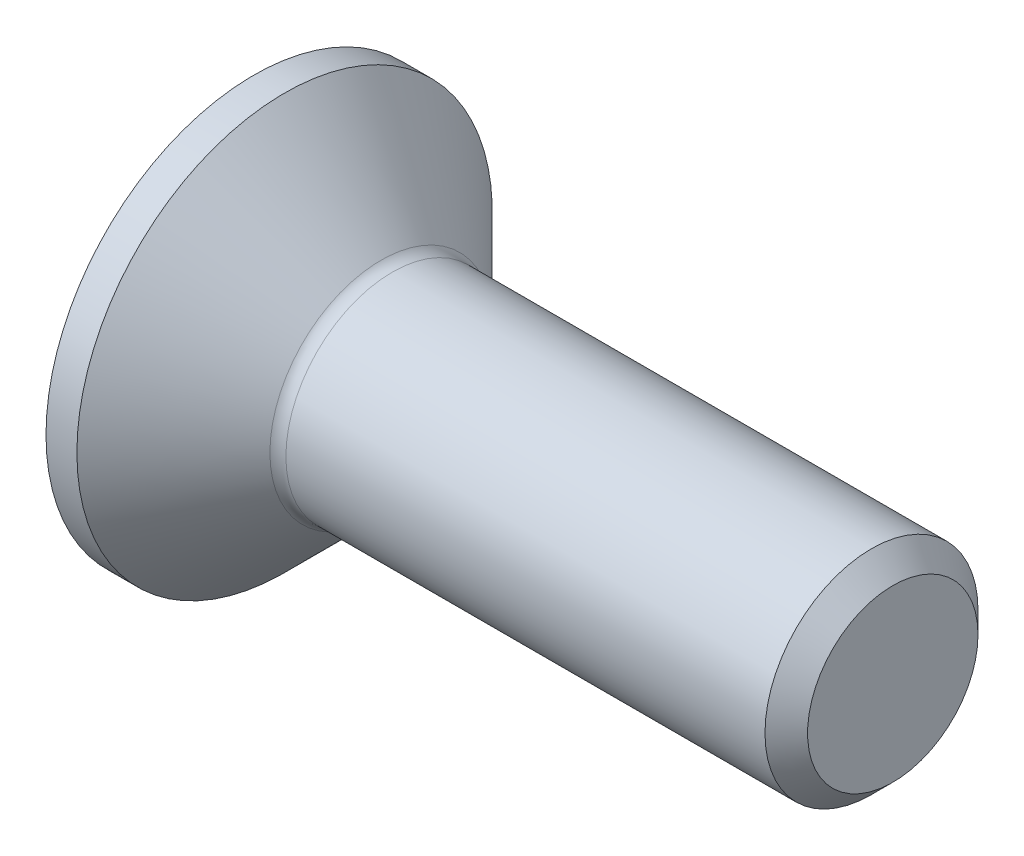
ISO-10303-21;
HEADER;
FILE_DESCRIPTION(('STEP AP214'),'2;1');
FILE_NAME('part.step','',(''),(''),'','','');
FILE_SCHEMA(('AUTOMOTIVE_DESIGN { 1 0 10303 214 1 1 1 1 }'));
ENDSEC;
DATA;
#1=APPLICATION_CONTEXT('core data for automotive mechanical design processes');
#2=APPLICATION_PROTOCOL_DEFINITION('international standard','automotive_design',2000,#1);
#3=PRODUCT_CONTEXT('',#1,'mechanical');
#4=PRODUCT('Part','Part','',(#3));
#5=PRODUCT_RELATED_PRODUCT_CATEGORY('part','',(#4));
#6=PRODUCT_DEFINITION_FORMATION('','',#4);
#7=PRODUCT_DEFINITION_CONTEXT('part definition',#1,'design');
#8=PRODUCT_DEFINITION('design','',#6,#7);
#9=PRODUCT_DEFINITION_SHAPE('','',#8);
#10=(LENGTH_UNIT() NAMED_UNIT(*) SI_UNIT(.MILLI.,.METRE.));
#11=(NAMED_UNIT(*) PLANE_ANGLE_UNIT() SI_UNIT($,.RADIAN.));
#12=(NAMED_UNIT(*) SI_UNIT($,.STERADIAN.) SOLID_ANGLE_UNIT());
#13=UNCERTAINTY_MEASURE_WITH_UNIT(LENGTH_MEASURE(1.E-05),#10,'distance_accuracy_value','');
#14=(GEOMETRIC_REPRESENTATION_CONTEXT(3) GLOBAL_UNCERTAINTY_ASSIGNED_CONTEXT((#13)) GLOBAL_UNIT_ASSIGNED_CONTEXT((#10,
#11,#12)) REPRESENTATION_CONTEXT('',''));
#15=CARTESIAN_POINT('',(0.,0.,0.));
#16=DIRECTION('',(0.,0.,1.));
#17=DIRECTION('',(1.,0.,0.));
#18=AXIS2_PLACEMENT_3D('',#15,#16,#17);
#19=CARTESIAN_POINT('',(0.,0.,0.));
#20=DIRECTION('',(-1.,0.,0.));
#21=DIRECTION('',(0.,0.,1.));
#22=AXIS2_PLACEMENT_3D('',#19,#20,#21);
#23=PLANE('',#22);
#24=CARTESIAN_POINT('',(0.,0.,0.));
#25=DIRECTION('',(-1.,0.,0.));
#26=DIRECTION('',(0.,0.,1.));
#27=AXIS2_PLACEMENT_3D('',#24,#25,#26);
#28=CIRCLE('',#27,3.9);
#29=CARTESIAN_POINT('',(0.,0.,3.9));
#30=VERTEX_POINT('',#29);
#31=EDGE_CURVE('E181',#30,#30,#28,.T.);
#32=ORIENTED_EDGE('',*,*,#31,.T.);
#33=EDGE_LOOP('',(#32));
#34=FACE_BOUND('',#33,.T.);
#35=DIRECTION('',(0.,-0.5,-0.866025403784439));
#36=VECTOR('',#35,1.);
#37=CARTESIAN_POINT('',(0.,-0.721687836487033,1.25));
#38=LINE('',#37,#36);
#39=CARTESIAN_POINT('',(0.,-0.721687836487033,1.25));
#40=VERTEX_POINT('',#39);
#41=CARTESIAN_POINT('',(0.,-1.44337567297406,0.));
#42=VERTEX_POINT('',#41);
#43=EDGE_CURVE('E135',#40,#42,#38,.T.);
#44=ORIENTED_EDGE('',*,*,#43,.T.);
#45=DIRECTION('',(0.,0.5,-0.866025403784439));
#46=VECTOR('',#45,1.);
#47=CARTESIAN_POINT('',(0.,-1.44337567297406,0.));
#48=LINE('',#47,#46);
#49=CARTESIAN_POINT('',(0.,-0.721687836487033,-1.25));
#50=VERTEX_POINT('',#49);
#51=EDGE_CURVE('E65',#42,#50,#48,.T.);
#52=ORIENTED_EDGE('',*,*,#51,.T.);
#53=DIRECTION('',(0.,1.,0.));
#54=VECTOR('',#53,1.);
#55=CARTESIAN_POINT('',(0.,-0.721687836487033,-1.25));
#56=LINE('',#55,#54);
#57=CARTESIAN_POINT('',(0.,0.721687836487032,-1.25));
#58=VERTEX_POINT('',#57);
#59=EDGE_CURVE('E147',#50,#58,#56,.T.);
#60=ORIENTED_EDGE('',*,*,#59,.T.);
#61=DIRECTION('',(0.,0.5,0.866025403784439));
#62=VECTOR('',#61,1.);
#63=CARTESIAN_POINT('',(0.,0.721687836487032,-1.25));
#64=LINE('',#63,#62);
#65=CARTESIAN_POINT('',(0.,1.44337567297406,0.));
#66=VERTEX_POINT('',#65);
#67=EDGE_CURVE('E497',#58,#66,#64,.T.);
#68=ORIENTED_EDGE('',*,*,#67,.T.);
#69=DIRECTION('',(0.,-0.5,0.866025403784439));
#70=VECTOR('',#69,1.);
#71=CARTESIAN_POINT('',(0.,1.44337567297406,0.));
#72=LINE('',#71,#70);
#73=CARTESIAN_POINT('',(0.,0.721687836487032,1.25));
#74=VERTEX_POINT('',#73);
#75=EDGE_CURVE('E501',#66,#74,#72,.T.);
#76=ORIENTED_EDGE('',*,*,#75,.T.);
#77=DIRECTION('',(0.,-1.,0.));
#78=VECTOR('',#77,1.);
#79=CARTESIAN_POINT('',(0.,0.721687836487032,1.25));
#80=LINE('',#79,#78);
#81=EDGE_CURVE('E505',#74,#40,#80,.T.);
#82=ORIENTED_EDGE('',*,*,#81,.T.);
#83=EDGE_LOOP('',(#44,#52,#60,#68,#76,#82));
#84=FACE_BOUND('',#83,.T.);
#85=ADVANCED_FACE('F49',(#34,#84),#23,.T.);
#86=CARTESIAN_POINT('',(0.,0.,0.));
#87=DIRECTION('',(-1.,0.,0.));
#88=DIRECTION('',(0.,0.,1.));
#89=AXIS2_PLACEMENT_3D('',#86,#87,#88);
#90=CYLINDRICAL_SURFACE('',#89,3.9);
#91=CARTESIAN_POINT('',(0.580000000000009,0.,0.));
#92=DIRECTION('',(-1.,0.,0.));
#93=DIRECTION('',(0.,0.,1.));
#94=AXIS2_PLACEMENT_3D('',#91,#92,#93);
#95=CIRCLE('',#94,3.9);
#96=CARTESIAN_POINT('',(0.580000000000009,0.,3.9));
#97=VERTEX_POINT('',#96);
#98=EDGE_CURVE('E165',#97,#97,#95,.T.);
#99=ORIENTED_EDGE('',*,*,#98,.T.);
#100=EDGE_LOOP('',(#99));
#101=FACE_BOUND('',#100,.T.);
#102=ORIENTED_EDGE('',*,*,#31,.F.);
#103=EDGE_LOOP('',(#102));
#104=FACE_BOUND('',#103,.T.);
#105=ADVANCED_FACE('F205',(#101,#104),#90,.T.);
#106=CARTESIAN_POINT('',(0.580000000000009,0.,0.));
#107=DIRECTION('',(-1.,0.,0.));
#108=DIRECTION('',(0.,0.,1.));
#109=AXIS2_PLACEMENT_3D('',#106,#107,#108);
#110=CONICAL_SURFACE('',#109,3.9,0.78539816339745);
#111=CARTESIAN_POINT('',(2.39213203435597,0.,0.));
#112=DIRECTION('',(-1.,0.,0.));
#113=DIRECTION('',(0.,0.,1.));
#114=AXIS2_PLACEMENT_3D('',#111,#112,#113);
#115=CIRCLE('',#114,2.08786796564404);
#116=CARTESIAN_POINT('',(2.39213203435597,0.,2.08786796564404));
#117=VERTEX_POINT('',#116);
#118=EDGE_CURVE('E189',#117,#117,#115,.T.);
#119=ORIENTED_EDGE('',*,*,#118,.T.);
#120=EDGE_LOOP('',(#119));
#121=FACE_BOUND('',#120,.T.);
#122=ORIENTED_EDGE('',*,*,#98,.F.);
#123=EDGE_LOOP('',(#122));
#124=FACE_BOUND('',#123,.T.);
#125=ADVANCED_FACE('F211',(#121,#124),#110,.T.);
#126=CARTESIAN_POINT('',(1.5,-1.44337567297406,0.));
#127=DIRECTION('',(0.,0.866025403784439,0.5));
#128=DIRECTION('',(0.,-0.5,0.866025403784439));
#129=AXIS2_PLACEMENT_3D('',#126,#127,#128);
#130=PLANE('',#129);
#131=ORIENTED_EDGE('',*,*,#51,.F.);
#132=DIRECTION('',(-1.,0.,0.));
#133=VECTOR('',#132,1.);
#134=CARTESIAN_POINT('',(1.5,-1.44337567297406,0.));
#135=LINE('',#134,#133);
#136=CARTESIAN_POINT('',(1.5,-1.44337567297406,0.));
#137=VERTEX_POINT('',#136);
#138=EDGE_CURVE('E486',#137,#42,#135,.T.);
#139=ORIENTED_EDGE('',*,*,#138,.F.);
#140=DIRECTION('',(0.,0.5,-0.866025403784439));
#141=VECTOR('',#140,1.);
#142=CARTESIAN_POINT('',(1.5,-1.44337567297406,0.));
#143=LINE('',#142,#141);
#144=CARTESIAN_POINT('',(1.5,-1.08253175473055,-0.625));
#145=VERTEX_POINT('',#144);
#146=EDGE_CURVE('E130',#137,#145,#143,.T.);
#147=ORIENTED_EDGE('',*,*,#146,.T.);
#148=CARTESIAN_POINT('',(1.5,-0.721687836487033,-1.25));
#149=VERTEX_POINT('',#148);
#150=EDGE_CURVE('E126',#145,#149,#143,.T.);
#151=ORIENTED_EDGE('',*,*,#150,.T.);
#152=DIRECTION('',(-1.,0.,0.));
#153=VECTOR('',#152,1.);
#154=CARTESIAN_POINT('',(1.5,-0.721687836487033,-1.25));
#155=LINE('',#154,#153);
#156=EDGE_CURVE('E128',#149,#50,#155,.T.);
#157=ORIENTED_EDGE('',*,*,#156,.T.);
#158=EDGE_LOOP('',(#131,#139,#147,#151,#157));
#159=FACE_BOUND('',#158,.T.);
#160=ADVANCED_FACE('F127',(#159),#130,.T.);
#161=CARTESIAN_POINT('',(1.5,-0.721687836487033,-1.25));
#162=DIRECTION('',(0.,0.,1.));
#163=DIRECTION('',(0.,-1.,0.));
#164=AXIS2_PLACEMENT_3D('',#161,#162,#163);
#165=PLANE('',#164);
#166=ORIENTED_EDGE('',*,*,#59,.F.);
#167=ORIENTED_EDGE('',*,*,#156,.F.);
#168=DIRECTION('',(0.,1.,0.));
#169=VECTOR('',#168,1.);
#170=CARTESIAN_POINT('',(1.5,-0.721687836487033,-1.25));
#171=LINE('',#170,#169);
#172=CARTESIAN_POINT('',(1.5,0.,-1.25));
#173=VERTEX_POINT('',#172);
#174=EDGE_CURVE('E73',#149,#173,#171,.T.);
#175=ORIENTED_EDGE('',*,*,#174,.T.);
#176=CARTESIAN_POINT('',(1.5,0.721687836487032,-1.25));
#177=VERTEX_POINT('',#176);
#178=EDGE_CURVE('E142',#173,#177,#171,.T.);
#179=ORIENTED_EDGE('',*,*,#178,.T.);
#180=DIRECTION('',(-1.,0.,0.));
#181=VECTOR('',#180,1.);
#182=CARTESIAN_POINT('',(1.5,0.721687836487032,-1.25));
#183=LINE('',#182,#181);
#184=EDGE_CURVE('E150',#177,#58,#183,.T.);
#185=ORIENTED_EDGE('',*,*,#184,.T.);
#186=EDGE_LOOP('',(#166,#167,#175,#179,#185));
#187=FACE_BOUND('',#186,.T.);
#188=ADVANCED_FACE('F144',(#187),#165,.T.);
#189=CARTESIAN_POINT('',(1.5,0.721687836487032,-1.25));
#190=DIRECTION('',(0.,-0.866025403784438,0.5));
#191=DIRECTION('',(0.,-0.5,-0.866025403784439));
#192=AXIS2_PLACEMENT_3D('',#189,#190,#191);
#193=PLANE('',#192);
#194=ORIENTED_EDGE('',*,*,#67,.F.);
#195=ORIENTED_EDGE('',*,*,#184,.F.);
#196=DIRECTION('',(0.,0.5,0.866025403784439));
#197=VECTOR('',#196,1.);
#198=CARTESIAN_POINT('',(1.5,0.721687836487032,-1.25));
#199=LINE('',#198,#197);
#200=CARTESIAN_POINT('',(1.5,1.08253175473055,-0.625));
#201=VERTEX_POINT('',#200);
#202=EDGE_CURVE('E538',#177,#201,#199,.T.);
#203=ORIENTED_EDGE('',*,*,#202,.T.);
#204=CARTESIAN_POINT('',(1.5,1.44337567297406,0.));
#205=VERTEX_POINT('',#204);
#206=EDGE_CURVE('E141',#201,#205,#199,.T.);
#207=ORIENTED_EDGE('',*,*,#206,.T.);
#208=DIRECTION('',(-1.,0.,0.));
#209=VECTOR('',#208,1.);
#210=CARTESIAN_POINT('',(1.5,1.44337567297406,0.));
#211=LINE('',#210,#209);
#212=EDGE_CURVE('E158',#205,#66,#211,.T.);
#213=ORIENTED_EDGE('',*,*,#212,.T.);
#214=EDGE_LOOP('',(#194,#195,#203,#207,#213));
#215=FACE_BOUND('',#214,.T.);
#216=ADVANCED_FACE('F229',(#215),#193,.T.);
#217=CARTESIAN_POINT('',(1.5,1.44337567297406,0.));
#218=DIRECTION('',(0.,-0.866025403784438,-0.5));
#219=DIRECTION('',(0.,0.5,-0.866025403784439));
#220=AXIS2_PLACEMENT_3D('',#217,#218,#219);
#221=PLANE('',#220);
#222=ORIENTED_EDGE('',*,*,#75,.F.);
#223=ORIENTED_EDGE('',*,*,#212,.F.);
#224=DIRECTION('',(0.,-0.5,0.866025403784439));
#225=VECTOR('',#224,1.);
#226=CARTESIAN_POINT('',(1.5,1.44337567297406,0.));
#227=LINE('',#226,#225);
#228=CARTESIAN_POINT('',(1.5,1.08253175473055,0.625));
#229=VERTEX_POINT('',#228);
#230=EDGE_CURVE('E531',#205,#229,#227,.T.);
#231=ORIENTED_EDGE('',*,*,#230,.T.);
#232=CARTESIAN_POINT('',(1.5,0.721687836487032,1.25));
#233=VERTEX_POINT('',#232);
#234=EDGE_CURVE('E535',#229,#233,#227,.T.);
#235=ORIENTED_EDGE('',*,*,#234,.T.);
#236=DIRECTION('',(-1.,0.,0.));
#237=VECTOR('',#236,1.);
#238=CARTESIAN_POINT('',(1.5,0.721687836487032,1.25));
#239=LINE('',#238,#237);
#240=EDGE_CURVE('E514',#233,#74,#239,.T.);
#241=ORIENTED_EDGE('',*,*,#240,.T.);
#242=EDGE_LOOP('',(#222,#223,#231,#235,#241));
#243=FACE_BOUND('',#242,.T.);
#244=ADVANCED_FACE('F232',(#243),#221,.T.);
#245=CARTESIAN_POINT('',(1.5,0.721687836487032,1.25));
#246=DIRECTION('',(0.,0.,-1.));
#247=DIRECTION('',(-1.,0.,0.));
#248=AXIS2_PLACEMENT_3D('',#245,#246,#247);
#249=PLANE('',#248);
#250=ORIENTED_EDGE('',*,*,#81,.F.);
#251=ORIENTED_EDGE('',*,*,#240,.F.);
#252=DIRECTION('',(0.,-1.,0.));
#253=VECTOR('',#252,1.);
#254=CARTESIAN_POINT('',(1.5,0.721687836487032,1.25));
#255=LINE('',#254,#253);
#256=CARTESIAN_POINT('',(1.5,0.,1.25));
#257=VERTEX_POINT('',#256);
#258=EDGE_CURVE('E478',#233,#257,#255,.T.);
#259=ORIENTED_EDGE('',*,*,#258,.T.);
#260=CARTESIAN_POINT('',(1.5,-0.721687836487033,1.25));
#261=VERTEX_POINT('',#260);
#262=EDGE_CURVE('E528',#257,#261,#255,.T.);
#263=ORIENTED_EDGE('',*,*,#262,.T.);
#264=DIRECTION('',(-1.,0.,0.));
#265=VECTOR('',#264,1.);
#266=CARTESIAN_POINT('',(1.5,-0.721687836487033,1.25));
#267=LINE('',#266,#265);
#268=EDGE_CURVE('E483',#261,#40,#267,.T.);
#269=ORIENTED_EDGE('',*,*,#268,.T.);
#270=EDGE_LOOP('',(#250,#251,#259,#263,#269));
#271=FACE_BOUND('',#270,.T.);
#272=ADVANCED_FACE('F236',(#271),#249,.T.);
#273=CARTESIAN_POINT('',(1.5,-0.721687836487033,1.25));
#274=DIRECTION('',(0.,0.866025403784439,-0.5));
#275=DIRECTION('',(0.,0.5,0.866025403784439));
#276=AXIS2_PLACEMENT_3D('',#273,#274,#275);
#277=PLANE('',#276);
#278=ORIENTED_EDGE('',*,*,#43,.F.);
#279=ORIENTED_EDGE('',*,*,#268,.F.);
#280=DIRECTION('',(0.,-0.5,-0.866025403784439));
#281=VECTOR('',#280,1.);
#282=CARTESIAN_POINT('',(1.5,-0.721687836487033,1.25));
#283=LINE('',#282,#281);
#284=CARTESIAN_POINT('',(1.5,-1.08253175473055,0.625));
#285=VERTEX_POINT('',#284);
#286=EDGE_CURVE('E477',#261,#285,#283,.T.);
#287=ORIENTED_EDGE('',*,*,#286,.T.);
#288=EDGE_CURVE('E474',#285,#137,#283,.T.);
#289=ORIENTED_EDGE('',*,*,#288,.T.);
#290=ORIENTED_EDGE('',*,*,#138,.T.);
#291=EDGE_LOOP('',(#278,#279,#287,#289,#290));
#292=FACE_BOUND('',#291,.T.);
#293=ADVANCED_FACE('F240',(#292),#277,.T.);
#294=CARTESIAN_POINT('',(1.5,0.,-2.5));
#295=DIRECTION('',(1.,0.,0.));
#296=DIRECTION('',(0.,0.,-1.));
#297=AXIS2_PLACEMENT_3D('',#294,#295,#296);
#298=PLANE('',#297);
#299=ORIENTED_EDGE('',*,*,#174,.F.);
#300=ORIENTED_EDGE('',*,*,#150,.F.);
#301=CARTESIAN_POINT('',(1.5,0.,0.));
#302=DIRECTION('',(-1.,0.,0.));
#303=DIRECTION('',(0.,0.,1.));
#304=AXIS2_PLACEMENT_3D('',#301,#302,#303);
#305=CIRCLE('',#304,1.25);
#306=EDGE_CURVE('E138',#173,#145,#305,.T.);
#307=ORIENTED_EDGE('',*,*,#306,.F.);
#308=EDGE_LOOP('',(#299,#300,#307));
#309=FACE_BOUND('',#308,.T.);
#310=ADVANCED_FACE('F137',(#309),#298,.F.);
#311=ORIENTED_EDGE('',*,*,#146,.F.);
#312=ORIENTED_EDGE('',*,*,#288,.F.);
#313=EDGE_CURVE('E156',#145,#285,#305,.T.);
#314=ORIENTED_EDGE('',*,*,#313,.F.);
#315=EDGE_LOOP('',(#311,#312,#314));
#316=FACE_BOUND('',#315,.T.);
#317=ADVANCED_FACE('F247',(#316),#298,.F.);
#318=ORIENTED_EDGE('',*,*,#286,.F.);
#319=ORIENTED_EDGE('',*,*,#262,.F.);
#320=EDGE_CURVE('E149',#285,#257,#305,.T.);
#321=ORIENTED_EDGE('',*,*,#320,.F.);
#322=EDGE_LOOP('',(#318,#319,#321));
#323=FACE_BOUND('',#322,.T.);
#324=ADVANCED_FACE('F317',(#323),#298,.F.);
#325=ORIENTED_EDGE('',*,*,#258,.F.);
#326=ORIENTED_EDGE('',*,*,#234,.F.);
#327=EDGE_CURVE('E157',#257,#229,#305,.T.);
#328=ORIENTED_EDGE('',*,*,#327,.F.);
#329=EDGE_LOOP('',(#325,#326,#328));
#330=FACE_BOUND('',#329,.T.);
#331=ADVANCED_FACE('F307',(#330),#298,.F.);
#332=ORIENTED_EDGE('',*,*,#230,.F.);
#333=ORIENTED_EDGE('',*,*,#206,.F.);
#334=EDGE_CURVE('E166',#229,#201,#305,.T.);
#335=ORIENTED_EDGE('',*,*,#334,.F.);
#336=EDGE_LOOP('',(#332,#333,#335));
#337=FACE_BOUND('',#336,.T.);
#338=ADVANCED_FACE('F298',(#337),#298,.F.);
#339=ORIENTED_EDGE('',*,*,#202,.F.);
#340=ORIENTED_EDGE('',*,*,#178,.F.);
#341=EDGE_CURVE('E464',#201,#173,#305,.T.);
#342=ORIENTED_EDGE('',*,*,#341,.F.);
#343=EDGE_LOOP('',(#339,#340,#342));
#344=FACE_BOUND('',#343,.T.);
#345=ADVANCED_FACE('F223',(#344),#298,.F.);
#346=CARTESIAN_POINT('',(1.5,0.,0.));
#347=DIRECTION('',(-1.,0.,0.));
#348=DIRECTION('',(0.,0.,1.));
#349=AXIS2_PLACEMENT_3D('',#346,#347,#348);
#350=CONICAL_SURFACE('',#349,1.25,1.0471975511966);
#351=CARTESIAN_POINT('',(2.22168783648704,0.,0.));
#352=VERTEX_POINT('',#351);
#353=VERTEX_LOOP('',#352);
#354=FACE_BOUND('',#353,.T.);
#355=ORIENTED_EDGE('',*,*,#327,.T.);
#356=ORIENTED_EDGE('',*,*,#334,.T.);
#357=ORIENTED_EDGE('',*,*,#341,.T.);
#358=ORIENTED_EDGE('',*,*,#306,.T.);
#359=ORIENTED_EDGE('',*,*,#313,.T.);
#360=ORIENTED_EDGE('',*,*,#320,.T.);
#361=EDGE_LOOP('',(#355,#356,#357,#358,#359,#360));
#362=FACE_BOUND('',#361,.T.);
#363=ADVANCED_FACE('F219',(#354,#362),#350,.F.);
#364=CARTESIAN_POINT('',(2.48,0.,0.));
#365=DIRECTION('',(1.,0.,0.));
#366=DIRECTION('',(0.,0.,-1.));
#367=AXIS2_PLACEMENT_3D('',#364,#365,#366);
#368=CYLINDRICAL_SURFACE('',#367,2.);
#369=CARTESIAN_POINT('',(11.6,0.,0.));
#370=DIRECTION('',(1.,0.,0.));
#371=DIRECTION('',(0.,0.,-1.));
#372=AXIS2_PLACEMENT_3D('',#369,#370,#371);
#373=CIRCLE('',#372,2.);
#374=CARTESIAN_POINT('',(11.6,0.,-2.));
#375=VERTEX_POINT('',#374);
#376=EDGE_CURVE('E12',#375,#375,#373,.F.);
#377=ORIENTED_EDGE('',*,*,#376,.T.);
#378=EDGE_LOOP('',(#377));
#379=FACE_BOUND('',#378,.T.);
#380=CARTESIAN_POINT('',(2.60426406871193,0.,0.));
#381=DIRECTION('',(1.,0.,0.));
#382=DIRECTION('',(0.,0.,-1.));
#383=AXIS2_PLACEMENT_3D('',#380,#381,#382);
#384=CIRCLE('',#383,2.);
#385=CARTESIAN_POINT('',(2.60426406871193,0.,-2.));
#386=VERTEX_POINT('',#385);
#387=EDGE_CURVE('E186',#386,#386,#384,.T.);
#388=ORIENTED_EDGE('',*,*,#387,.T.);
#389=EDGE_LOOP('',(#388));
#390=FACE_BOUND('',#389,.T.);
#391=ADVANCED_FACE('F222',(#379,#390),#368,.T.);
#392=CARTESIAN_POINT('',(12.,0.,0.));
#393=DIRECTION('',(1.,0.,0.));
#394=DIRECTION('',(0.,0.,-1.));
#395=AXIS2_PLACEMENT_3D('',#392,#393,#394);
#396=PLANE('',#395);
#397=CARTESIAN_POINT('',(12.,0.,0.));
#398=DIRECTION('',(1.,0.,0.));
#399=DIRECTION('',(0.,0.,-1.));
#400=AXIS2_PLACEMENT_3D('',#397,#398,#399);
#401=CIRCLE('',#400,1.6);
#402=CARTESIAN_POINT('',(12.,0.,-1.6));
#403=VERTEX_POINT('',#402);
#404=EDGE_CURVE('E58',#403,#403,#401,.T.);
#405=ORIENTED_EDGE('',*,*,#404,.T.);
#406=EDGE_LOOP('',(#405));
#407=FACE_BOUND('',#406,.T.);
#408=ADVANCED_FACE('F194',(#407),#396,.T.);
#409=CARTESIAN_POINT('',(2.60426406871193,0.,0.));
#410=DIRECTION('',(1.,0.,0.));
#411=DIRECTION('',(0.,0.,-1.));
#412=AXIS2_PLACEMENT_3D('',#409,#410,#411);
#413=TOROIDAL_SURFACE('',#412,2.3,0.3);
#414=ORIENTED_EDGE('',*,*,#118,.F.);
#415=EDGE_LOOP('',(#414));
#416=FACE_BOUND('',#415,.T.);
#417=ORIENTED_EDGE('',*,*,#387,.F.);
#418=EDGE_LOOP('',(#417));
#419=FACE_BOUND('',#418,.T.);
#420=ADVANCED_FACE('F197',(#416,#419),#413,.F.);
#421=CARTESIAN_POINT('',(12.,0.,0.));
#422=DIRECTION('',(-1.,0.,0.));
#423=DIRECTION('',(0.,0.,1.));
#424=AXIS2_PLACEMENT_3D('',#421,#422,#423);
#425=CONICAL_SURFACE('',#424,1.6,0.785398163397447);
#426=ORIENTED_EDGE('',*,*,#376,.F.);
#427=EDGE_LOOP('',(#426));
#428=FACE_BOUND('',#427,.T.);
#429=ORIENTED_EDGE('',*,*,#404,.F.);
#430=EDGE_LOOP('',(#429));
#431=FACE_BOUND('',#430,.T.);
#432=ADVANCED_FACE('F52',(#428,#431),#425,.T.);
#433=CLOSED_SHELL('',(#85,#105,#125,#160,#188,#216,#244,#272,#293,#310,#317,#324,#331,#338,#345,
#363,#391,#408,#420,#432));
#434=MANIFOLD_SOLID_BREP('B2',#433);
#435=ADVANCED_BREP_SHAPE_REPRESENTATION('',(#18,#434),#14);
#436=SHAPE_DEFINITION_REPRESENTATION(#9,#435);
ENDSEC;
END-ISO-10303-21;
